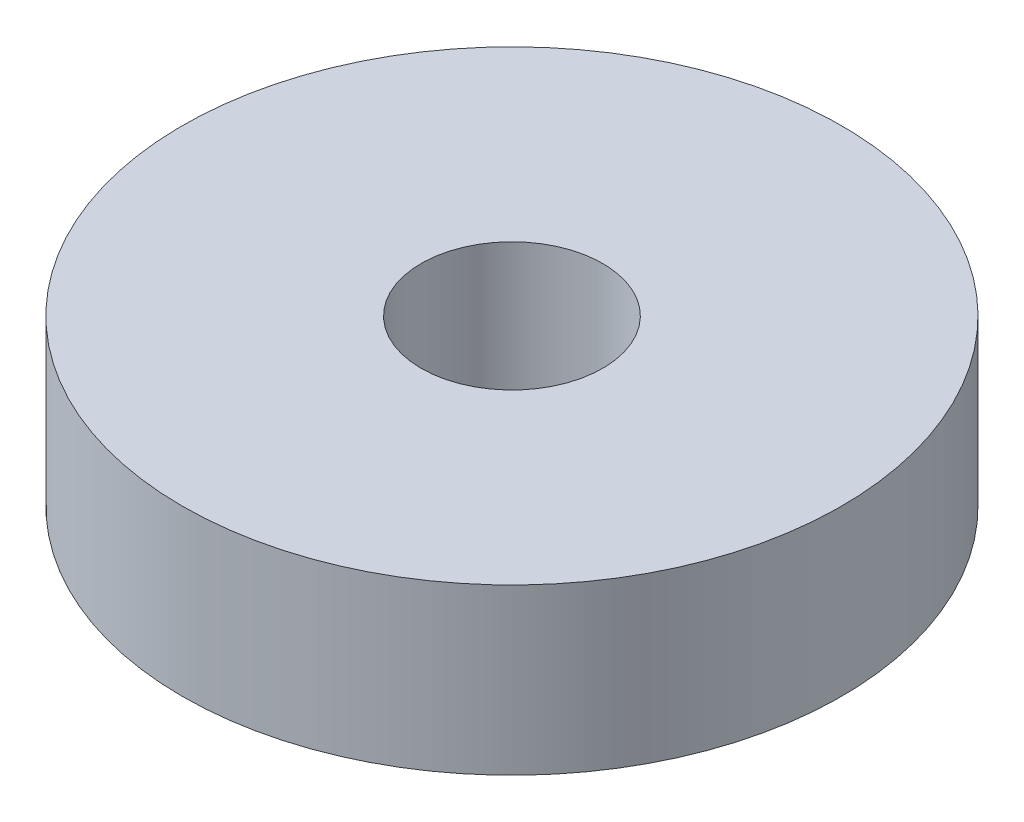
ISO-10303-21;
HEADER;
FILE_DESCRIPTION(('STEP AP214'),'2;1');
FILE_NAME('part.step','',(''),(''),'','','');
FILE_SCHEMA(('AUTOMOTIVE_DESIGN { 1 0 10303 214 1 1 1 1 }'));
ENDSEC;
DATA;
#1=APPLICATION_CONTEXT('core data for automotive mechanical design processes');
#2=APPLICATION_PROTOCOL_DEFINITION('international standard','automotive_design',2000,#1);
#3=PRODUCT_CONTEXT('',#1,'mechanical');
#4=PRODUCT('Part','Part','',(#3));
#5=PRODUCT_RELATED_PRODUCT_CATEGORY('part','',(#4));
#6=PRODUCT_DEFINITION_FORMATION('','',#4);
#7=PRODUCT_DEFINITION_CONTEXT('part definition',#1,'design');
#8=PRODUCT_DEFINITION('design','',#6,#7);
#9=PRODUCT_DEFINITION_SHAPE('','',#8);
#10=(LENGTH_UNIT() NAMED_UNIT(*) SI_UNIT(.MILLI.,.METRE.));
#11=(NAMED_UNIT(*) PLANE_ANGLE_UNIT() SI_UNIT($,.RADIAN.));
#12=(NAMED_UNIT(*) SI_UNIT($,.STERADIAN.) SOLID_ANGLE_UNIT());
#13=UNCERTAINTY_MEASURE_WITH_UNIT(LENGTH_MEASURE(1.E-05),#10,'distance_accuracy_value','');
#14=(GEOMETRIC_REPRESENTATION_CONTEXT(3) GLOBAL_UNCERTAINTY_ASSIGNED_CONTEXT((#13)) GLOBAL_UNIT_ASSIGNED_CONTEXT((#10,
#11,#12)) REPRESENTATION_CONTEXT('',''));
#15=CARTESIAN_POINT('',(0.,0.,0.));
#16=DIRECTION('',(0.,0.,1.));
#17=DIRECTION('',(1.,0.,0.));
#18=AXIS2_PLACEMENT_3D('',#15,#16,#17);
#19=CARTESIAN_POINT('',(0.,3.175,0.));
#20=DIRECTION('',(0.,1.,0.));
#21=DIRECTION('',(0.,0.,1.));
#22=AXIS2_PLACEMENT_3D('',#19,#20,#21);
#23=PLANE('',#22);
#24=CARTESIAN_POINT('',(0.,3.175,0.));
#25=DIRECTION('',(0.,1.,0.));
#26=DIRECTION('',(0.,0.,1.));
#27=AXIS2_PLACEMENT_3D('',#24,#25,#26);
#28=CIRCLE('',#27,6.35);
#29=CARTESIAN_POINT('',(0.,3.175,6.35));
#30=VERTEX_POINT('',#29);
#31=EDGE_CURVE('E10',#30,#30,#28,.T.);
#32=ORIENTED_EDGE('',*,*,#31,.T.);
#33=EDGE_LOOP('',(#32));
#34=FACE_BOUND('',#33,.T.);
#35=CARTESIAN_POINT('',(0.,3.175,0.));
#36=DIRECTION('',(0.,1.,0.));
#37=DIRECTION('',(0.,0.,1.));
#38=AXIS2_PLACEMENT_3D('',#35,#36,#37);
#39=CIRCLE('',#38,1.75);
#40=CARTESIAN_POINT('',(0.,3.175,1.75));
#41=VERTEX_POINT('',#40);
#42=EDGE_CURVE('E48',#41,#41,#39,.T.);
#43=ORIENTED_EDGE('',*,*,#42,.F.);
#44=EDGE_LOOP('',(#43));
#45=FACE_BOUND('',#44,.T.);
#46=ADVANCED_FACE('F37',(#34,#45),#23,.T.);
#47=CARTESIAN_POINT('',(0.,0.,0.));
#48=DIRECTION('',(0.,1.,0.));
#49=DIRECTION('',(0.,0.,1.));
#50=AXIS2_PLACEMENT_3D('',#47,#48,#49);
#51=PLANE('',#50);
#52=CARTESIAN_POINT('',(0.,0.,0.));
#53=DIRECTION('',(0.,1.,0.));
#54=DIRECTION('',(0.,0.,1.));
#55=AXIS2_PLACEMENT_3D('',#52,#53,#54);
#56=CIRCLE('',#55,6.35);
#57=CARTESIAN_POINT('',(0.,0.,6.35));
#58=VERTEX_POINT('',#57);
#59=EDGE_CURVE('E41',#58,#58,#56,.T.);
#60=ORIENTED_EDGE('',*,*,#59,.F.);
#61=EDGE_LOOP('',(#60));
#62=FACE_BOUND('',#61,.T.);
#63=CARTESIAN_POINT('',(0.,0.,0.));
#64=DIRECTION('',(0.,1.,0.));
#65=DIRECTION('',(0.,0.,1.));
#66=AXIS2_PLACEMENT_3D('',#63,#64,#65);
#67=CIRCLE('',#66,1.75);
#68=CARTESIAN_POINT('',(0.,0.,1.75));
#69=VERTEX_POINT('',#68);
#70=EDGE_CURVE('E50',#69,#69,#67,.T.);
#71=ORIENTED_EDGE('',*,*,#70,.T.);
#72=EDGE_LOOP('',(#71));
#73=FACE_BOUND('',#72,.T.);
#74=ADVANCED_FACE('F60',(#62,#73),#51,.F.);
#75=CARTESIAN_POINT('',(0.,3.175,0.));
#76=DIRECTION('',(0.,-1.,0.));
#77=DIRECTION('',(0.,0.,-1.));
#78=AXIS2_PLACEMENT_3D('',#75,#76,#77);
#79=CYLINDRICAL_SURFACE('',#78,6.35);
#80=ORIENTED_EDGE('',*,*,#31,.F.);
#81=EDGE_LOOP('',(#80));
#82=FACE_BOUND('',#81,.T.);
#83=ORIENTED_EDGE('',*,*,#59,.T.);
#84=EDGE_LOOP('',(#83));
#85=FACE_BOUND('',#84,.T.);
#86=ADVANCED_FACE('F39',(#82,#85),#79,.T.);
#87=CARTESIAN_POINT('',(0.,3.175,0.));
#88=DIRECTION('',(0.,-1.,0.));
#89=DIRECTION('',(0.,0.,-1.));
#90=AXIS2_PLACEMENT_3D('',#87,#88,#89);
#91=CYLINDRICAL_SURFACE('',#90,1.75);
#92=ORIENTED_EDGE('',*,*,#42,.T.);
#93=EDGE_LOOP('',(#92));
#94=FACE_BOUND('',#93,.T.);
#95=ORIENTED_EDGE('',*,*,#70,.F.);
#96=EDGE_LOOP('',(#95));
#97=FACE_BOUND('',#96,.T.);
#98=ADVANCED_FACE('F56',(#94,#97),#91,.F.);
#99=CLOSED_SHELL('',(#46,#74,#86,#98));
#100=MANIFOLD_SOLID_BREP('B2',#99);
#101=ADVANCED_BREP_SHAPE_REPRESENTATION('',(#18,#100),#14);
#102=SHAPE_DEFINITION_REPRESENTATION(#9,#101);
ENDSEC;
END-ISO-10303-21;
